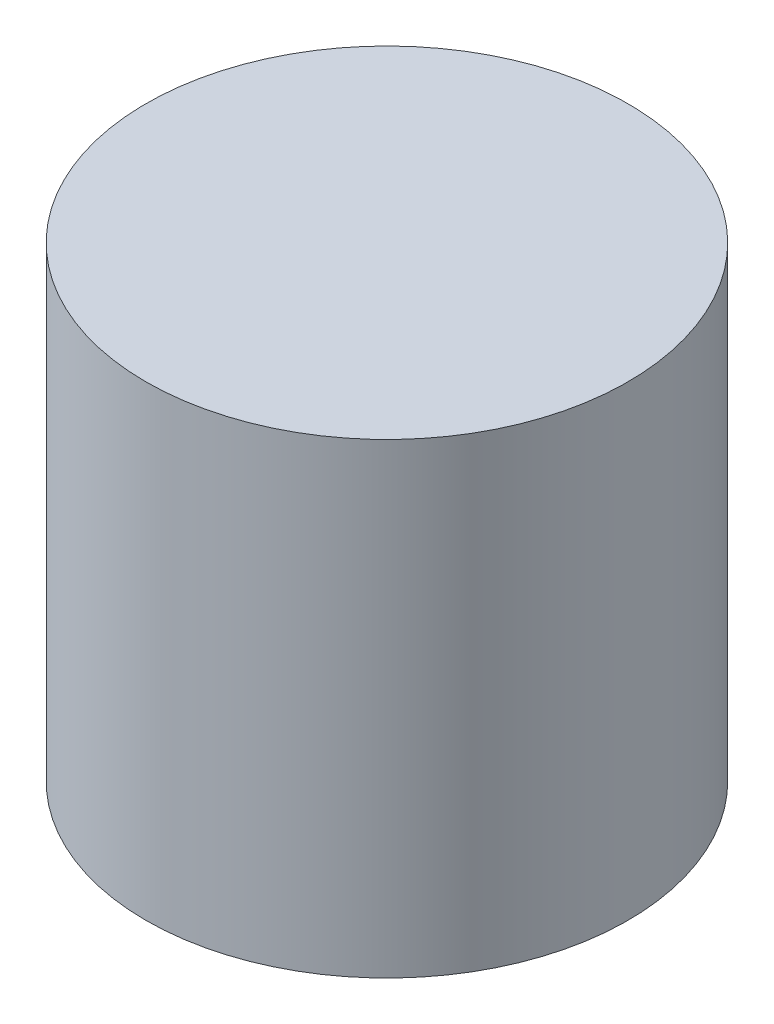
ISO-10303-21;
HEADER;
FILE_DESCRIPTION(('STEP AP214'),'2;1');
FILE_NAME('part.step','',(''),(''),'','','');
FILE_SCHEMA(('AUTOMOTIVE_DESIGN { 1 0 10303 214 1 1 1 1 }'));
ENDSEC;
DATA;
#1=APPLICATION_CONTEXT('core data for automotive mechanical design processes');
#2=APPLICATION_PROTOCOL_DEFINITION('international standard','automotive_design',2000,#1);
#3=PRODUCT_CONTEXT('',#1,'mechanical');
#4=PRODUCT('Part','Part','',(#3));
#5=PRODUCT_RELATED_PRODUCT_CATEGORY('part','',(#4));
#6=PRODUCT_DEFINITION_FORMATION('','',#4);
#7=PRODUCT_DEFINITION_CONTEXT('part definition',#1,'design');
#8=PRODUCT_DEFINITION('design','',#6,#7);
#9=PRODUCT_DEFINITION_SHAPE('','',#8);
#10=(LENGTH_UNIT() NAMED_UNIT(*) SI_UNIT(.MILLI.,.METRE.));
#11=(NAMED_UNIT(*) PLANE_ANGLE_UNIT() SI_UNIT($,.RADIAN.));
#12=(NAMED_UNIT(*) SI_UNIT($,.STERADIAN.) SOLID_ANGLE_UNIT());
#13=UNCERTAINTY_MEASURE_WITH_UNIT(LENGTH_MEASURE(1.E-05),#10,'distance_accuracy_value','');
#14=(GEOMETRIC_REPRESENTATION_CONTEXT(3) GLOBAL_UNCERTAINTY_ASSIGNED_CONTEXT((#13)) GLOBAL_UNIT_ASSIGNED_CONTEXT((#10,
#11,#12)) REPRESENTATION_CONTEXT('',''));
#15=CARTESIAN_POINT('',(0.,0.,0.));
#16=DIRECTION('',(0.,0.,1.));
#17=DIRECTION('',(1.,0.,0.));
#18=AXIS2_PLACEMENT_3D('',#15,#16,#17);
#19=CARTESIAN_POINT('',(0.,6.,0.));
#20=DIRECTION('',(0.,-1.,0.));
#21=DIRECTION('',(0.,0.,-1.));
#22=AXIS2_PLACEMENT_3D('',#19,#20,#21);
#23=CYLINDRICAL_SURFACE('',#22,3.1);
#24=CARTESIAN_POINT('',(0.,6.,0.));
#25=DIRECTION('',(0.,1.,0.));
#26=DIRECTION('',(0.,0.,1.));
#27=AXIS2_PLACEMENT_3D('',#24,#25,#26);
#28=CIRCLE('',#27,3.1);
#29=CARTESIAN_POINT('',(0.,6.,3.1));
#30=VERTEX_POINT('',#29);
#31=EDGE_CURVE('E11',#30,#30,#28,.T.);
#32=ORIENTED_EDGE('',*,*,#31,.F.);
#33=EDGE_LOOP('',(#32));
#34=FACE_BOUND('',#33,.T.);
#35=CARTESIAN_POINT('',(0.,0.,0.));
#36=DIRECTION('',(0.,1.,0.));
#37=DIRECTION('',(0.,0.,1.));
#38=AXIS2_PLACEMENT_3D('',#35,#36,#37);
#39=CIRCLE('',#38,3.1);
#40=CARTESIAN_POINT('',(0.,0.,3.1));
#41=VERTEX_POINT('',#40);
#42=EDGE_CURVE('E38',#41,#41,#39,.T.);
#43=ORIENTED_EDGE('',*,*,#42,.T.);
#44=EDGE_LOOP('',(#43));
#45=FACE_BOUND('',#44,.T.);
#46=ADVANCED_FACE('F35',(#34,#45),#23,.T.);
#47=CARTESIAN_POINT('',(0.,6.,0.));
#48=DIRECTION('',(0.,1.,0.));
#49=DIRECTION('',(0.,0.,1.));
#50=AXIS2_PLACEMENT_3D('',#47,#48,#49);
#51=PLANE('',#50);
#52=ORIENTED_EDGE('',*,*,#31,.T.);
#53=EDGE_LOOP('',(#52));
#54=FACE_BOUND('',#53,.T.);
#55=ADVANCED_FACE('F69',(#54),#51,.T.);
#56=CARTESIAN_POINT('',(0.,0.,0.));
#57=DIRECTION('',(0.,1.,0.));
#58=DIRECTION('',(0.,0.,1.));
#59=AXIS2_PLACEMENT_3D('',#56,#57,#58);
#60=PLANE('',#59);
#61=CARTESIAN_POINT('',(0.,0.,0.));
#62=DIRECTION('',(0.,1.,0.));
#63=DIRECTION('',(0.,0.,1.));
#64=AXIS2_PLACEMENT_3D('',#61,#62,#63);
#65=CIRCLE('',#64,1.975);
#66=CARTESIAN_POINT('',(0.,0.,1.975));
#67=VERTEX_POINT('',#66);
#68=EDGE_CURVE('E49',#67,#67,#65,.T.);
#69=ORIENTED_EDGE('',*,*,#68,.T.);
#70=EDGE_LOOP('',(#69));
#71=FACE_BOUND('',#70,.T.);
#72=ORIENTED_EDGE('',*,*,#42,.F.);
#73=EDGE_LOOP('',(#72));
#74=FACE_BOUND('',#73,.T.);
#75=ADVANCED_FACE('F53',(#71,#74),#60,.F.);
#76=CARTESIAN_POINT('',(0.,11.5861435713737,0.));
#77=DIRECTION('',(0.,-1.,0.));
#78=DIRECTION('',(0.,0.,-1.));
#79=AXIS2_PLACEMENT_3D('',#76,#77,#78);
#80=CYLINDRICAL_SURFACE('',#79,1.975);
#81=ORIENTED_EDGE('',*,*,#68,.F.);
#82=EDGE_LOOP('',(#81));
#83=FACE_BOUND('',#82,.T.);
#84=CARTESIAN_POINT('',(0.,4.,0.));
#85=DIRECTION('',(0.,1.,0.));
#86=DIRECTION('',(0.,0.,1.));
#87=AXIS2_PLACEMENT_3D('',#84,#85,#86);
#88=CIRCLE('',#87,1.975);
#89=CARTESIAN_POINT('',(0.,4.,1.975));
#90=VERTEX_POINT('',#89);
#91=EDGE_CURVE('E45',#90,#90,#88,.T.);
#92=ORIENTED_EDGE('',*,*,#91,.T.);
#93=EDGE_LOOP('',(#92));
#94=FACE_BOUND('',#93,.T.);
#95=ADVANCED_FACE('F56',(#83,#94),#80,.F.);
#96=CARTESIAN_POINT('',(0.,4.,0.));
#97=DIRECTION('',(0.,1.,0.));
#98=DIRECTION('',(0.,0.,1.));
#99=AXIS2_PLACEMENT_3D('',#96,#97,#98);
#100=PLANE('',#99);
#101=ORIENTED_EDGE('',*,*,#91,.F.);
#102=EDGE_LOOP('',(#101));
#103=FACE_BOUND('',#102,.T.);
#104=ADVANCED_FACE('F59',(#103),#100,.F.);
#105=CLOSED_SHELL('',(#46,#55,#75,#95,#104));
#106=MANIFOLD_SOLID_BREP('B2',#105);
#107=ADVANCED_BREP_SHAPE_REPRESENTATION('',(#18,#106),#14);
#108=SHAPE_DEFINITION_REPRESENTATION(#9,#107);
ENDSEC;
END-ISO-10303-21;
